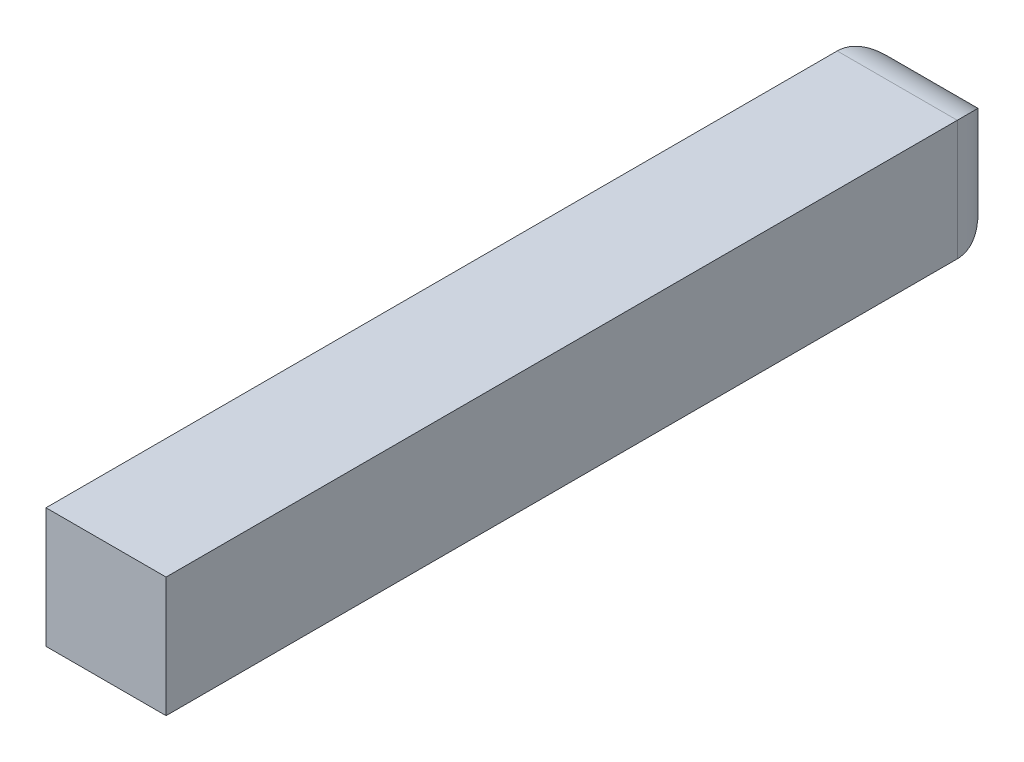
ISO-10303-21;
HEADER;
FILE_DESCRIPTION(('STEP AP214'),'2;1');
FILE_NAME('part.step','',(''),(''),'','','');
FILE_SCHEMA(('AUTOMOTIVE_DESIGN { 1 0 10303 214 1 1 1 1 }'));
ENDSEC;
DATA;
#1=APPLICATION_CONTEXT('core data for automotive mechanical design processes');
#2=APPLICATION_PROTOCOL_DEFINITION('international standard','automotive_design',2000,#1);
#3=PRODUCT_CONTEXT('',#1,'mechanical');
#4=PRODUCT('Part','Part','',(#3));
#5=PRODUCT_RELATED_PRODUCT_CATEGORY('part','',(#4));
#6=PRODUCT_DEFINITION_FORMATION('','',#4);
#7=PRODUCT_DEFINITION_CONTEXT('part definition',#1,'design');
#8=PRODUCT_DEFINITION('design','',#6,#7);
#9=PRODUCT_DEFINITION_SHAPE('','',#8);
#10=(LENGTH_UNIT() NAMED_UNIT(*) SI_UNIT(.MILLI.,.METRE.));
#11=(NAMED_UNIT(*) PLANE_ANGLE_UNIT() SI_UNIT($,.RADIAN.));
#12=(NAMED_UNIT(*) SI_UNIT($,.STERADIAN.) SOLID_ANGLE_UNIT());
#13=UNCERTAINTY_MEASURE_WITH_UNIT(LENGTH_MEASURE(1.E-05),#10,'distance_accuracy_value','');
#14=(GEOMETRIC_REPRESENTATION_CONTEXT(3) GLOBAL_UNCERTAINTY_ASSIGNED_CONTEXT((#13)) GLOBAL_UNIT_ASSIGNED_CONTEXT((#10,
#11,#12)) REPRESENTATION_CONTEXT('',''));
#15=CARTESIAN_POINT('',(0.,0.,0.));
#16=DIRECTION('',(0.,0.,1.));
#17=DIRECTION('',(1.,0.,0.));
#18=AXIS2_PLACEMENT_3D('',#15,#16,#17);
#19=CARTESIAN_POINT('',(-0.3,0.,0.));
#20=DIRECTION('',(1.,0.,0.));
#21=DIRECTION('',(0.,0.,-1.));
#22=AXIS2_PLACEMENT_3D('',#19,#20,#21);
#23=PLANE('',#22);
#24=DIRECTION('',(0.,0.,-1.));
#25=VECTOR('',#24,1.);
#26=CARTESIAN_POINT('',(-0.3,3.51,0.));
#27=LINE('',#26,#25);
#28=CARTESIAN_POINT('',(-0.3,3.51,1.05377588272));
#29=VERTEX_POINT('',#28);
#30=CARTESIAN_POINT('',(-0.3,3.51,-2.9));
#31=VERTEX_POINT('',#30);
#32=EDGE_CURVE('E11',#29,#31,#27,.T.);
#33=ORIENTED_EDGE('',*,*,#32,.F.);
#34=DIRECTION('',(0.,-1.,0.));
#35=VECTOR('',#34,1.);
#36=CARTESIAN_POINT('',(-0.3,0.,1.05377588272));
#37=LINE('',#36,#35);
#38=CARTESIAN_POINT('',(-0.3,4.11,1.05377588272));
#39=VERTEX_POINT('',#38);
#40=EDGE_CURVE('E24',#39,#29,#37,.T.);
#41=ORIENTED_EDGE('',*,*,#40,.F.);
#42=DIRECTION('',(0.,0.,1.));
#43=VECTOR('',#42,1.);
#44=CARTESIAN_POINT('',(-0.3,4.11,0.));
#45=LINE('',#44,#43);
#46=CARTESIAN_POINT('',(-0.3,4.11,-2.9));
#47=VERTEX_POINT('',#46);
#48=EDGE_CURVE('E141',#47,#39,#45,.T.);
#49=ORIENTED_EDGE('',*,*,#48,.F.);
#50=DIRECTION('',(0.,1.,0.));
#51=VECTOR('',#50,1.);
#52=CARTESIAN_POINT('',(-0.3,0.,-2.9));
#53=LINE('',#52,#51);
#54=EDGE_CURVE('E135',#31,#47,#53,.T.);
#55=ORIENTED_EDGE('',*,*,#54,.F.);
#56=EDGE_LOOP('',(#33,#41,#49,#55));
#57=FACE_BOUND('',#56,.T.);
#58=ADVANCED_FACE('F17',(#57),#23,.F.);
#59=CARTESIAN_POINT('',(-0.05,11.43,-2.9));
#60=DIRECTION('',(0.,1.,0.));
#61=DIRECTION('',(0.,0.,1.));
#62=AXIS2_PLACEMENT_3D('',#59,#60,#61);
#63=CYLINDRICAL_SURFACE('',#62,0.25);
#64=CARTESIAN_POINT('',(-0.3,4.11,-2.9));
#65=CARTESIAN_POINT('',(-0.3,4.11,-3.04644660940673));
#66=CARTESIAN_POINT('',(-0.196446609406726,4.00644660940673,-3.15));
#67=CARTESIAN_POINT('',(-0.05,3.86,-3.15));
#68=(BOUNDED_CURVE() B_SPLINE_CURVE(3,(#64,#65,#66,#67),.UNSPECIFIED.,.F.,
.F.) B_SPLINE_CURVE_WITH_KNOTS((4,4),(0.,1.5707963267949),
.UNSPECIFIED.) CURVE() GEOMETRIC_REPRESENTATION_ITEM() RATIONAL_B_SPLINE_CURVE((1.,
0.804737854124365,0.804737854124365,1.)) REPRESENTATION_ITEM(''));
#69=CARTESIAN_POINT('',(-0.05,3.86,-3.15));
#70=VERTEX_POINT('',#69);
#71=EDGE_CURVE('E131',#47,#70,#68,.T.);
#72=ORIENTED_EDGE('',*,*,#71,.T.);
#73=DIRECTION('',(0.,-1.,0.));
#74=VECTOR('',#73,1.);
#75=CARTESIAN_POINT('',(-0.05,11.43,-3.15));
#76=LINE('',#75,#74);
#77=CARTESIAN_POINT('',(-0.05,3.76,-3.15));
#78=VERTEX_POINT('',#77);
#79=EDGE_CURVE('E126',#70,#78,#76,.T.);
#80=ORIENTED_EDGE('',*,*,#79,.T.);
#81=CARTESIAN_POINT('',(-0.05,3.76,-3.15));
#82=CARTESIAN_POINT('',(-0.196446609406726,3.61355339059327,-3.15));
#83=CARTESIAN_POINT('',(-0.3,3.51,-3.04644660940673));
#84=CARTESIAN_POINT('',(-0.3,3.51,-2.9));
#85=(BOUNDED_CURVE() B_SPLINE_CURVE(3,(#81,#82,#83,#84),.UNSPECIFIED.,.F.,
.F.) B_SPLINE_CURVE_WITH_KNOTS((4,4),(1.5707963267949,3.14159265358979),
.UNSPECIFIED.) CURVE() GEOMETRIC_REPRESENTATION_ITEM() RATIONAL_B_SPLINE_CURVE((1.,
0.804737854124365,0.804737854124365,1.)) REPRESENTATION_ITEM(''));
#86=EDGE_CURVE('E85',#78,#31,#85,.T.);
#87=ORIENTED_EDGE('',*,*,#86,.T.);
#88=ORIENTED_EDGE('',*,*,#54,.T.);
#89=EDGE_LOOP('',(#72,#80,#87,#88));
#90=FACE_BOUND('',#89,.T.);
#91=ADVANCED_FACE('F157',(#90),#63,.T.);
#92=CARTESIAN_POINT('',(0.,3.51,1.05377588272));
#93=DIRECTION('',(0.,-1.,0.));
#94=DIRECTION('',(0.,0.,-1.));
#95=AXIS2_PLACEMENT_3D('',#92,#93,#94);
#96=PLANE('',#95);
#97=ORIENTED_EDGE('',*,*,#32,.T.);
#98=DIRECTION('',(1.,0.,0.));
#99=VECTOR('',#98,1.);
#100=CARTESIAN_POINT('',(0.,3.51,-2.9));
#101=LINE('',#100,#99);
#102=CARTESIAN_POINT('',(0.3,3.51,-2.9));
#103=VERTEX_POINT('',#102);
#104=EDGE_CURVE('E121',#31,#103,#101,.T.);
#105=ORIENTED_EDGE('',*,*,#104,.T.);
#106=DIRECTION('',(0.,0.,1.));
#107=VECTOR('',#106,1.);
#108=CARTESIAN_POINT('',(0.3,3.51,1.05377588272));
#109=LINE('',#108,#107);
#110=CARTESIAN_POINT('',(0.3,3.51,1.05377588272));
#111=VERTEX_POINT('',#110);
#112=EDGE_CURVE('E119',#103,#111,#109,.T.);
#113=ORIENTED_EDGE('',*,*,#112,.T.);
#114=DIRECTION('',(-1.,0.,0.));
#115=VECTOR('',#114,1.);
#116=CARTESIAN_POINT('',(0.,3.51,1.05377588272));
#117=LINE('',#116,#115);
#118=EDGE_CURVE('E117',#111,#29,#117,.T.);
#119=ORIENTED_EDGE('',*,*,#118,.T.);
#120=EDGE_LOOP('',(#97,#105,#113,#119));
#121=FACE_BOUND('',#120,.T.);
#122=ADVANCED_FACE('F147',(#121),#96,.T.);
#123=CARTESIAN_POINT('',(0.,11.13,1.05377588272));
#124=DIRECTION('',(0.,0.,-1.));
#125=DIRECTION('',(-1.,0.,0.));
#126=AXIS2_PLACEMENT_3D('',#123,#124,#125);
#127=PLANE('',#126);
#128=ORIENTED_EDGE('',*,*,#40,.T.);
#129=ORIENTED_EDGE('',*,*,#118,.F.);
#130=DIRECTION('',(0.,-1.,0.));
#131=VECTOR('',#130,1.);
#132=CARTESIAN_POINT('',(0.3,11.13,1.05377588272));
#133=LINE('',#132,#131);
#134=CARTESIAN_POINT('',(0.3,4.11,1.05377588272));
#135=VERTEX_POINT('',#134);
#136=EDGE_CURVE('E114',#135,#111,#133,.T.);
#137=ORIENTED_EDGE('',*,*,#136,.F.);
#138=DIRECTION('',(1.,0.,0.));
#139=VECTOR('',#138,1.);
#140=CARTESIAN_POINT('',(0.,4.11,1.05377588272));
#141=LINE('',#140,#139);
#142=EDGE_CURVE('E111',#39,#135,#141,.T.);
#143=ORIENTED_EDGE('',*,*,#142,.F.);
#144=EDGE_LOOP('',(#128,#129,#137,#143));
#145=FACE_BOUND('',#144,.T.);
#146=ADVANCED_FACE('F146',(#145),#127,.F.);
#147=CARTESIAN_POINT('',(0.,4.11,-3.15));
#148=DIRECTION('',(0.,1.,0.));
#149=DIRECTION('',(0.,0.,1.));
#150=AXIS2_PLACEMENT_3D('',#147,#148,#149);
#151=PLANE('',#150);
#152=DIRECTION('',(0.,0.,-1.));
#153=VECTOR('',#152,1.);
#154=CARTESIAN_POINT('',(0.3,4.11,-3.15));
#155=LINE('',#154,#153);
#156=CARTESIAN_POINT('',(0.3,4.11,-2.9));
#157=VERTEX_POINT('',#156);
#158=EDGE_CURVE('E109',#135,#157,#155,.T.);
#159=ORIENTED_EDGE('',*,*,#158,.T.);
#160=DIRECTION('',(-1.,0.,0.));
#161=VECTOR('',#160,1.);
#162=CARTESIAN_POINT('',(0.,4.11,-2.9));
#163=LINE('',#162,#161);
#164=EDGE_CURVE('E106',#157,#47,#163,.T.);
#165=ORIENTED_EDGE('',*,*,#164,.T.);
#166=ORIENTED_EDGE('',*,*,#48,.T.);
#167=ORIENTED_EDGE('',*,*,#142,.T.);
#168=EDGE_LOOP('',(#159,#165,#166,#167));
#169=FACE_BOUND('',#168,.T.);
#170=ADVANCED_FACE('F153',(#169),#151,.T.);
#171=CARTESIAN_POINT('',(0.,11.73,-3.15));
#172=DIRECTION('',(0.,0.,1.));
#173=DIRECTION('',(1.,0.,0.));
#174=AXIS2_PLACEMENT_3D('',#171,#172,#173);
#175=PLANE('',#174);
#176=ORIENTED_EDGE('',*,*,#79,.F.);
#177=DIRECTION('',(-1.,0.,0.));
#178=VECTOR('',#177,1.);
#179=CARTESIAN_POINT('',(0.,3.86,-3.15));
#180=LINE('',#179,#178);
#181=CARTESIAN_POINT('',(0.05,3.86,-3.15));
#182=VERTEX_POINT('',#181);
#183=EDGE_CURVE('E71',#182,#70,#180,.T.);
#184=ORIENTED_EDGE('',*,*,#183,.F.);
#185=DIRECTION('',(0.,1.,0.));
#186=VECTOR('',#185,1.);
#187=CARTESIAN_POINT('',(0.05,11.73,-3.15));
#188=LINE('',#187,#186);
#189=CARTESIAN_POINT('',(0.05,3.76,-3.15));
#190=VERTEX_POINT('',#189);
#191=EDGE_CURVE('E65',#190,#182,#188,.T.);
#192=ORIENTED_EDGE('',*,*,#191,.F.);
#193=DIRECTION('',(1.,0.,0.));
#194=VECTOR('',#193,1.);
#195=CARTESIAN_POINT('',(0.,3.76,-3.15));
#196=LINE('',#195,#194);
#197=EDGE_CURVE('E69',#78,#190,#196,.T.);
#198=ORIENTED_EDGE('',*,*,#197,.F.);
#199=EDGE_LOOP('',(#176,#184,#192,#198));
#200=FACE_BOUND('',#199,.T.);
#201=ADVANCED_FACE('F68',(#200),#175,.F.);
#202=CARTESIAN_POINT('',(0.,3.86,-2.9));
#203=DIRECTION('',(1.,0.,0.));
#204=DIRECTION('',(0.,0.,-1.));
#205=AXIS2_PLACEMENT_3D('',#202,#203,#204);
#206=CYLINDRICAL_SURFACE('',#205,0.25);
#207=CARTESIAN_POINT('',(0.3,4.11,-2.9));
#208=CARTESIAN_POINT('',(0.3,4.11,-3.04644660940673));
#209=CARTESIAN_POINT('',(0.196446609406726,4.00644660940673,-3.15));
#210=CARTESIAN_POINT('',(0.05,3.86,-3.15));
#211=(BOUNDED_CURVE() B_SPLINE_CURVE(3,(#207,#208,#209,#210),.UNSPECIFIED.,.F.,
.F.) B_SPLINE_CURVE_WITH_KNOTS((4,4),(0.,1.5707963267949),
.UNSPECIFIED.) CURVE() GEOMETRIC_REPRESENTATION_ITEM() RATIONAL_B_SPLINE_CURVE((1.,
0.804737854124365,0.804737854124365,1.)) REPRESENTATION_ITEM(''));
#212=EDGE_CURVE('E86',#157,#182,#211,.T.);
#213=ORIENTED_EDGE('',*,*,#212,.T.);
#214=ORIENTED_EDGE('',*,*,#183,.T.);
#215=ORIENTED_EDGE('',*,*,#71,.F.);
#216=ORIENTED_EDGE('',*,*,#164,.F.);
#217=EDGE_LOOP('',(#213,#214,#215,#216));
#218=FACE_BOUND('',#217,.T.);
#219=ADVANCED_FACE('F159',(#218),#206,.T.);
#220=CARTESIAN_POINT('',(0.,3.76,-2.9));
#221=DIRECTION('',(1.,0.,0.));
#222=DIRECTION('',(0.,0.,-1.));
#223=AXIS2_PLACEMENT_3D('',#220,#221,#222);
#224=CYLINDRICAL_SURFACE('',#223,0.25);
#225=ORIENTED_EDGE('',*,*,#86,.F.);
#226=ORIENTED_EDGE('',*,*,#197,.T.);
#227=CARTESIAN_POINT('',(0.05,3.76,-3.15));
#228=CARTESIAN_POINT('',(0.196446609406726,3.61355339059327,-3.15));
#229=CARTESIAN_POINT('',(0.3,3.51,-3.04644660940673));
#230=CARTESIAN_POINT('',(0.3,3.51,-2.9));
#231=(BOUNDED_CURVE() B_SPLINE_CURVE(3,(#227,#228,#229,#230),.UNSPECIFIED.,.F.,
.F.) B_SPLINE_CURVE_WITH_KNOTS((4,4),(4.71238898038469,6.28318530717959),
.UNSPECIFIED.) CURVE() GEOMETRIC_REPRESENTATION_ITEM() RATIONAL_B_SPLINE_CURVE((1.,
0.804737854124365,0.804737854124365,1.)) REPRESENTATION_ITEM(''));
#232=EDGE_CURVE('E82',#190,#103,#231,.T.);
#233=ORIENTED_EDGE('',*,*,#232,.T.);
#234=ORIENTED_EDGE('',*,*,#104,.F.);
#235=EDGE_LOOP('',(#225,#226,#233,#234));
#236=FACE_BOUND('',#235,.T.);
#237=ADVANCED_FACE('F80',(#236),#224,.T.);
#238=CARTESIAN_POINT('',(0.3,0.,0.));
#239=DIRECTION('',(1.,0.,0.));
#240=DIRECTION('',(0.,0.,-1.));
#241=AXIS2_PLACEMENT_3D('',#238,#239,#240);
#242=PLANE('',#241);
#243=ORIENTED_EDGE('',*,*,#112,.F.);
#244=DIRECTION('',(0.,1.,0.));
#245=VECTOR('',#244,1.);
#246=CARTESIAN_POINT('',(0.3,0.,-2.9));
#247=LINE('',#246,#245);
#248=EDGE_CURVE('E90',#103,#157,#247,.T.);
#249=ORIENTED_EDGE('',*,*,#248,.T.);
#250=ORIENTED_EDGE('',*,*,#158,.F.);
#251=ORIENTED_EDGE('',*,*,#136,.T.);
#252=EDGE_LOOP('',(#243,#249,#250,#251));
#253=FACE_BOUND('',#252,.T.);
#254=ADVANCED_FACE('F150',(#253),#242,.T.);
#255=CARTESIAN_POINT('',(0.05,11.43,-2.9));
#256=DIRECTION('',(0.,1.,0.));
#257=DIRECTION('',(0.,0.,1.));
#258=AXIS2_PLACEMENT_3D('',#255,#256,#257);
#259=CYLINDRICAL_SURFACE('',#258,0.25);
#260=ORIENTED_EDGE('',*,*,#232,.F.);
#261=ORIENTED_EDGE('',*,*,#191,.T.);
#262=ORIENTED_EDGE('',*,*,#212,.F.);
#263=ORIENTED_EDGE('',*,*,#248,.F.);
#264=EDGE_LOOP('',(#260,#261,#262,#263));
#265=FACE_BOUND('',#264,.T.);
#266=ADVANCED_FACE('F88',(#265),#259,.T.);
#267=CLOSED_SHELL('',(#58,#91,#122,#146,#170,#201,#219,#237,#254,#266));
#268=MANIFOLD_SOLID_BREP('B1',#267);
#269=ADVANCED_BREP_SHAPE_REPRESENTATION('',(#18,#268),#14);
#270=SHAPE_DEFINITION_REPRESENTATION(#9,#269);
ENDSEC;
END-ISO-10303-21;
